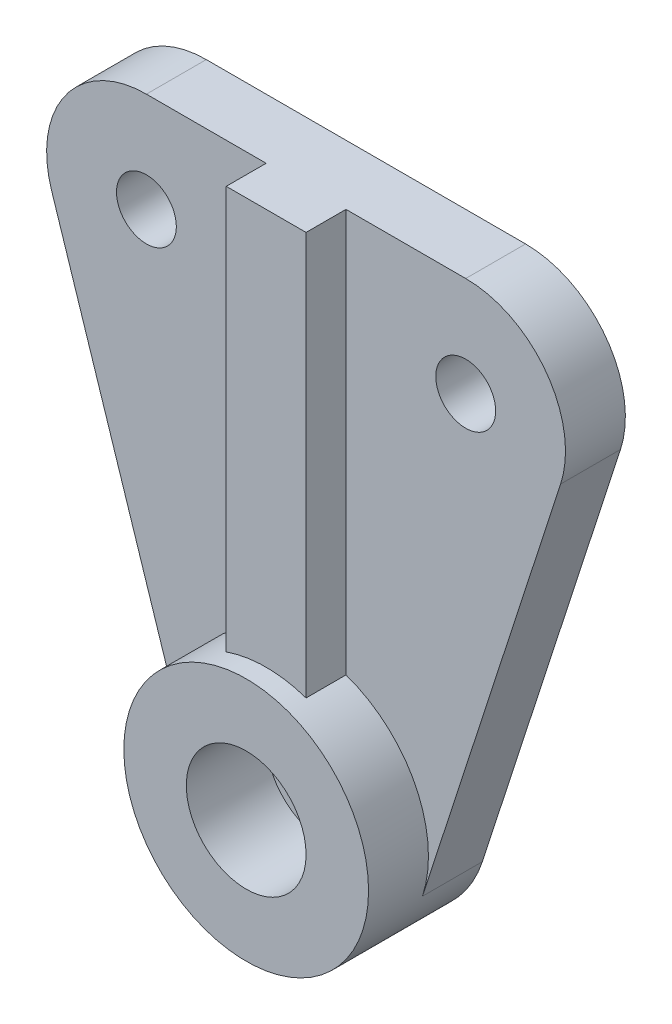
ISO-10303-21;
HEADER;
FILE_DESCRIPTION(('STEP AP214'),'2;1');
FILE_NAME('part.step','',(''),(''),'','','');
FILE_SCHEMA(('AUTOMOTIVE_DESIGN { 1 0 10303 214 1 1 1 1 }'));
ENDSEC;
DATA;
#1=APPLICATION_CONTEXT('core data for automotive mechanical design processes');
#2=APPLICATION_PROTOCOL_DEFINITION('international standard','automotive_design',2000,#1);
#3=PRODUCT_CONTEXT('',#1,'mechanical');
#4=PRODUCT('Part','Part','',(#3));
#5=PRODUCT_RELATED_PRODUCT_CATEGORY('part','',(#4));
#6=PRODUCT_DEFINITION_FORMATION('','',#4);
#7=PRODUCT_DEFINITION_CONTEXT('part definition',#1,'design');
#8=PRODUCT_DEFINITION('design','',#6,#7);
#9=PRODUCT_DEFINITION_SHAPE('','',#8);
#10=(LENGTH_UNIT() NAMED_UNIT(*) SI_UNIT(.MILLI.,.METRE.));
#11=(NAMED_UNIT(*) PLANE_ANGLE_UNIT() SI_UNIT($,.RADIAN.));
#12=(NAMED_UNIT(*) SI_UNIT($,.STERADIAN.) SOLID_ANGLE_UNIT());
#13=UNCERTAINTY_MEASURE_WITH_UNIT(LENGTH_MEASURE(1.E-05),#10,'distance_accuracy_value','');
#14=(GEOMETRIC_REPRESENTATION_CONTEXT(3) GLOBAL_UNCERTAINTY_ASSIGNED_CONTEXT((#13)) GLOBAL_UNIT_ASSIGNED_CONTEXT((#10,
#11,#12)) REPRESENTATION_CONTEXT('',''));
#15=CARTESIAN_POINT('',(0.,0.,0.));
#16=DIRECTION('',(0.,0.,1.));
#17=DIRECTION('',(1.,0.,0.));
#18=AXIS2_PLACEMENT_3D('',#15,#16,#17);
#19=CARTESIAN_POINT('',(-8.,21.,3.));
#20=DIRECTION('',(0.,0.,1.));
#21=DIRECTION('',(1.,0.,0.));
#22=AXIS2_PLACEMENT_3D('',#19,#20,#21);
#23=PLANE('',#22);
#24=CARTESIAN_POINT('',(8.,21.,3.));
#25=DIRECTION('',(0.,0.,1.));
#26=DIRECTION('',(1.,0.,0.));
#27=AXIS2_PLACEMENT_3D('',#24,#25,#26);
#28=CIRCLE('',#27,1.5);
#29=CARTESIAN_POINT('',(9.5,21.,3.));
#30=VERTEX_POINT('',#29);
#31=EDGE_CURVE('E151',#30,#30,#28,.T.);
#32=ORIENTED_EDGE('',*,*,#31,.F.);
#33=EDGE_LOOP('',(#32));
#34=FACE_BOUND('',#33,.T.);
#35=DIRECTION('',(-1.,0.,0.));
#36=VECTOR('',#35,1.);
#37=CARTESIAN_POINT('',(-8.,26.,3.));
#38=LINE('',#37,#36);
#39=CARTESIAN_POINT('',(8.,26.,3.));
#40=VERTEX_POINT('',#39);
#41=CARTESIAN_POINT('',(2.,26.,3.));
#42=VERTEX_POINT('',#41);
#43=EDGE_CURVE('E169',#40,#42,#38,.T.);
#44=ORIENTED_EDGE('',*,*,#43,.T.);
#45=DIRECTION('',(0.,1.,0.));
#46=VECTOR('',#45,1.);
#47=CARTESIAN_POINT('',(2.,5.34684015405273,3.));
#48=LINE('',#47,#46);
#49=CARTESIAN_POINT('',(2.,5.79627489310511,3.));
#50=VERTEX_POINT('',#49);
#51=EDGE_CURVE('E127',#50,#42,#48,.T.);
#52=ORIENTED_EDGE('',*,*,#51,.F.);
#53=CARTESIAN_POINT('',(0.,0.,3.));
#54=DIRECTION('',(0.,0.,1.));
#55=DIRECTION('',(1.,0.,0.));
#56=AXIS2_PLACEMENT_3D('',#53,#54,#55);
#57=CIRCLE('',#56,6.13162316490834);
#58=CARTESIAN_POINT('',(5.83257689393837,-1.89152039712419,3.));
#59=VERTEX_POINT('',#58);
#60=EDGE_CURVE('E142',#59,#50,#57,.T.);
#61=ORIENTED_EDGE('',*,*,#60,.F.);
#62=DIRECTION('',(0.308486080480203,0.951228856874076,0.));
#63=VECTOR('',#62,1.);
#64=CARTESIAN_POINT('',(5.83257689393837,-1.89152039712419,3.));
#65=LINE('',#64,#63);
#66=CARTESIAN_POINT('',(12.7561442843704,19.457569597599,3.));
#67=VERTEX_POINT('',#66);
#68=EDGE_CURVE('E164',#59,#67,#65,.T.);
#69=ORIENTED_EDGE('',*,*,#68,.T.);
#70=CARTESIAN_POINT('',(8.,21.,3.));
#71=DIRECTION('',(0.,0.,1.));
#72=DIRECTION('',(1.,0.,0.));
#73=AXIS2_PLACEMENT_3D('',#70,#71,#72);
#74=CIRCLE('',#73,5.);
#75=EDGE_CURVE('E166',#67,#40,#74,.T.);
#76=ORIENTED_EDGE('',*,*,#75,.T.);
#77=EDGE_LOOP('',(#44,#52,#61,#69,#76));
#78=FACE_BOUND('',#77,.T.);
#79=ADVANCED_FACE('F32',(#34,#78),#23,.T.);
#80=CARTESIAN_POINT('',(-8.,21.,3.));
#81=DIRECTION('',(0.,0.,1.));
#82=DIRECTION('',(1.,0.,0.));
#83=AXIS2_PLACEMENT_3D('',#80,#81,#82);
#84=CIRCLE('',#83,1.5);
#85=CARTESIAN_POINT('',(-6.5,21.,3.));
#86=VERTEX_POINT('',#85);
#87=EDGE_CURVE('E145',#86,#86,#84,.T.);
#88=ORIENTED_EDGE('',*,*,#87,.F.);
#89=EDGE_LOOP('',(#88));
#90=FACE_BOUND('',#89,.T.);
#91=CARTESIAN_POINT('',(-2.,5.79627489310511,3.));
#92=VERTEX_POINT('',#91);
#93=CARTESIAN_POINT('',(-5.83257689393837,-1.89152039712419,3.));
#94=VERTEX_POINT('',#93);
#95=EDGE_CURVE('E144',#92,#94,#57,.T.);
#96=ORIENTED_EDGE('',*,*,#95,.F.);
#97=DIRECTION('',(0.,-1.,0.));
#98=VECTOR('',#97,1.);
#99=CARTESIAN_POINT('',(-2.,5.34684015405273,3.));
#100=LINE('',#99,#98);
#101=CARTESIAN_POINT('',(-2.,26.,3.));
#102=VERTEX_POINT('',#101);
#103=EDGE_CURVE('E113',#102,#92,#100,.T.);
#104=ORIENTED_EDGE('',*,*,#103,.F.);
#105=CARTESIAN_POINT('',(-8.,26.,3.));
#106=VERTEX_POINT('',#105);
#107=EDGE_CURVE('E168',#102,#106,#38,.T.);
#108=ORIENTED_EDGE('',*,*,#107,.T.);
#109=CARTESIAN_POINT('',(-8.,21.,3.));
#110=DIRECTION('',(0.,0.,1.));
#111=DIRECTION('',(1.,0.,0.));
#112=AXIS2_PLACEMENT_3D('',#109,#110,#111);
#113=CIRCLE('',#112,5.);
#114=CARTESIAN_POINT('',(-12.7561442843704,19.457569597599,3.));
#115=VERTEX_POINT('',#114);
#116=EDGE_CURVE('E157',#106,#115,#113,.T.);
#117=ORIENTED_EDGE('',*,*,#116,.T.);
#118=DIRECTION('',(0.308486080480203,-0.951228856874076,0.));
#119=VECTOR('',#118,1.);
#120=CARTESIAN_POINT('',(-12.7561442843704,19.457569597599,3.));
#121=LINE('',#120,#119);
#122=EDGE_CURVE('E160',#115,#94,#121,.T.);
#123=ORIENTED_EDGE('',*,*,#122,.T.);
#124=EDGE_LOOP('',(#96,#104,#108,#117,#123));
#125=FACE_BOUND('',#124,.T.);
#126=ADVANCED_FACE('F231',(#90,#125),#23,.T.);
#127=CARTESIAN_POINT('',(0.,0.,3.));
#128=DIRECTION('',(0.,0.,-1.));
#129=DIRECTION('',(-1.,0.,0.));
#130=AXIS2_PLACEMENT_3D('',#127,#128,#129);
#131=CYLINDRICAL_SURFACE('',#130,6.13162316490834);
#132=CARTESIAN_POINT('',(0.,0.,6.));
#133=DIRECTION('',(0.,0.,1.));
#134=DIRECTION('',(1.,0.,0.));
#135=AXIS2_PLACEMENT_3D('',#132,#133,#134);
#136=CIRCLE('',#135,6.13162316490834);
#137=CARTESIAN_POINT('',(6.13162316490834,0.,6.));
#138=VERTEX_POINT('',#137);
#139=EDGE_CURVE('E137',#138,#138,#136,.T.);
#140=ORIENTED_EDGE('',*,*,#139,.F.);
#141=EDGE_LOOP('',(#140));
#142=FACE_BOUND('',#141,.T.);
#143=DIRECTION('',(0.,0.,-1.));
#144=VECTOR('',#143,1.);
#145=CARTESIAN_POINT('',(2.,5.7962748931051,3.));
#146=LINE('',#145,#144);
#147=CARTESIAN_POINT('',(2.,5.7962748931051,5.));
#148=VERTEX_POINT('',#147);
#149=EDGE_CURVE('E11',#148,#50,#146,.T.);
#150=ORIENTED_EDGE('',*,*,#149,.F.);
#151=CARTESIAN_POINT('',(0.,0.,5.));
#152=DIRECTION('',(0.,0.,-1.));
#153=DIRECTION('',(-1.,0.,0.));
#154=AXIS2_PLACEMENT_3D('',#151,#152,#153);
#155=CIRCLE('',#154,6.13162316490834);
#156=CARTESIAN_POINT('',(-2.,5.79627489310511,5.));
#157=VERTEX_POINT('',#156);
#158=EDGE_CURVE('E49',#157,#148,#155,.T.);
#159=ORIENTED_EDGE('',*,*,#158,.F.);
#160=DIRECTION('',(0.,0.,-1.));
#161=VECTOR('',#160,1.);
#162=CARTESIAN_POINT('',(-2.,5.79627489310511,3.));
#163=LINE('',#162,#161);
#164=EDGE_CURVE('E40',#92,#157,#163,.F.);
#165=ORIENTED_EDGE('',*,*,#164,.F.);
#166=ORIENTED_EDGE('',*,*,#95,.T.);
#167=DIRECTION('',(0.,0.,-1.));
#168=VECTOR('',#167,1.);
#169=CARTESIAN_POINT('',(-5.83257689393837,-1.89152039712419,3.));
#170=LINE('',#169,#168);
#171=CARTESIAN_POINT('',(-5.83257689393837,-1.89152039712419,0.));
#172=VERTEX_POINT('',#171);
#173=EDGE_CURVE('E194',#94,#172,#170,.T.);
#174=ORIENTED_EDGE('',*,*,#173,.T.);
#175=CARTESIAN_POINT('',(0.,0.,0.));
#176=DIRECTION('',(0.,0.,1.));
#177=DIRECTION('',(1.,0.,0.));
#178=AXIS2_PLACEMENT_3D('',#175,#176,#177);
#179=CIRCLE('',#178,6.13162316490834);
#180=CARTESIAN_POINT('',(5.83257689393837,-1.89152039712419,0.));
#181=VERTEX_POINT('',#180);
#182=EDGE_CURVE('E176',#172,#181,#179,.T.);
#183=ORIENTED_EDGE('',*,*,#182,.T.);
#184=DIRECTION('',(0.,0.,-1.));
#185=VECTOR('',#184,1.);
#186=CARTESIAN_POINT('',(5.83257689393837,-1.89152039712419,3.));
#187=LINE('',#186,#185);
#188=EDGE_CURVE('E191',#59,#181,#187,.T.);
#189=ORIENTED_EDGE('',*,*,#188,.F.);
#190=ORIENTED_EDGE('',*,*,#60,.T.);
#191=EDGE_LOOP('',(#150,#159,#165,#166,#174,#183,#189,#190));
#192=FACE_BOUND('',#191,.T.);
#193=ADVANCED_FACE('F228',(#142,#192),#131,.T.);
#194=CARTESIAN_POINT('',(-8.,21.,0.));
#195=DIRECTION('',(0.,0.,1.));
#196=DIRECTION('',(1.,0.,0.));
#197=AXIS2_PLACEMENT_3D('',#194,#195,#196);
#198=PLANE('',#197);
#199=CARTESIAN_POINT('',(-8.,21.,0.));
#200=DIRECTION('',(0.,0.,1.));
#201=DIRECTION('',(1.,0.,0.));
#202=AXIS2_PLACEMENT_3D('',#199,#200,#201);
#203=CIRCLE('',#202,5.);
#204=CARTESIAN_POINT('',(-8.,26.,0.));
#205=VERTEX_POINT('',#204);
#206=CARTESIAN_POINT('',(-12.7561442843704,19.457569597599,0.));
#207=VERTEX_POINT('',#206);
#208=EDGE_CURVE('E154',#205,#207,#203,.T.);
#209=ORIENTED_EDGE('',*,*,#208,.F.);
#210=DIRECTION('',(-1.,0.,0.));
#211=VECTOR('',#210,1.);
#212=CARTESIAN_POINT('',(-8.,26.,0.));
#213=LINE('',#212,#211);
#214=CARTESIAN_POINT('',(8.,26.,0.));
#215=VERTEX_POINT('',#214);
#216=EDGE_CURVE('E161',#215,#205,#213,.T.);
#217=ORIENTED_EDGE('',*,*,#216,.F.);
#218=CARTESIAN_POINT('',(8.,21.,0.));
#219=DIRECTION('',(0.,0.,1.));
#220=DIRECTION('',(1.,0.,0.));
#221=AXIS2_PLACEMENT_3D('',#218,#219,#220);
#222=CIRCLE('',#221,5.);
#223=CARTESIAN_POINT('',(12.7561442843704,19.457569597599,0.));
#224=VERTEX_POINT('',#223);
#225=EDGE_CURVE('E180',#224,#215,#222,.T.);
#226=ORIENTED_EDGE('',*,*,#225,.F.);
#227=DIRECTION('',(0.308486080480203,0.951228856874076,0.));
#228=VECTOR('',#227,1.);
#229=CARTESIAN_POINT('',(5.83257689393837,-1.89152039712419,0.));
#230=LINE('',#229,#228);
#231=EDGE_CURVE('E178',#181,#224,#230,.T.);
#232=ORIENTED_EDGE('',*,*,#231,.F.);
#233=ORIENTED_EDGE('',*,*,#182,.F.);
#234=DIRECTION('',(0.308486080480203,-0.951228856874076,0.));
#235=VECTOR('',#234,1.);
#236=CARTESIAN_POINT('',(-12.7561442843704,19.457569597599,0.));
#237=LINE('',#236,#235);
#238=EDGE_CURVE('E174',#207,#172,#237,.T.);
#239=ORIENTED_EDGE('',*,*,#238,.F.);
#240=EDGE_LOOP('',(#209,#217,#226,#232,#233,#239));
#241=FACE_BOUND('',#240,.T.);
#242=CARTESIAN_POINT('',(8.,21.,0.));
#243=DIRECTION('',(0.,0.,1.));
#244=DIRECTION('',(1.,0.,0.));
#245=AXIS2_PLACEMENT_3D('',#242,#243,#244);
#246=CIRCLE('',#245,1.5);
#247=CARTESIAN_POINT('',(9.5,21.,0.));
#248=VERTEX_POINT('',#247);
#249=EDGE_CURVE('E148',#248,#248,#246,.T.);
#250=ORIENTED_EDGE('',*,*,#249,.T.);
#251=EDGE_LOOP('',(#250));
#252=FACE_BOUND('',#251,.T.);
#253=CARTESIAN_POINT('',(-8.,21.,0.));
#254=DIRECTION('',(0.,0.,1.));
#255=DIRECTION('',(1.,0.,0.));
#256=AXIS2_PLACEMENT_3D('',#253,#254,#255);
#257=CIRCLE('',#256,1.5);
#258=CARTESIAN_POINT('',(-6.5,21.,0.));
#259=VERTEX_POINT('',#258);
#260=EDGE_CURVE('E141',#259,#259,#257,.T.);
#261=ORIENTED_EDGE('',*,*,#260,.T.);
#262=EDGE_LOOP('',(#261));
#263=FACE_BOUND('',#262,.T.);
#264=CARTESIAN_POINT('',(0.,0.,0.));
#265=DIRECTION('',(0.,0.,-1.));
#266=DIRECTION('',(-1.,0.,0.));
#267=AXIS2_PLACEMENT_3D('',#264,#265,#266);
#268=CIRCLE('',#267,1.6);
#269=CARTESIAN_POINT('',(-1.6,0.,0.));
#270=VERTEX_POINT('',#269);
#271=EDGE_CURVE('E128',#270,#270,#268,.T.);
#272=ORIENTED_EDGE('',*,*,#271,.F.);
#273=EDGE_LOOP('',(#272));
#274=FACE_BOUND('',#273,.T.);
#275=ADVANCED_FACE('F230',(#241,#252,#263,#274),#198,.F.);
#276=CARTESIAN_POINT('',(-8.,21.,3.));
#277=DIRECTION('',(0.,0.,-1.));
#278=DIRECTION('',(-1.,0.,0.));
#279=AXIS2_PLACEMENT_3D('',#276,#277,#278);
#280=CYLINDRICAL_SURFACE('',#279,5.);
#281=ORIENTED_EDGE('',*,*,#208,.T.);
#282=DIRECTION('',(0.,0.,-1.));
#283=VECTOR('',#282,1.);
#284=CARTESIAN_POINT('',(-12.7561442843704,19.457569597599,3.));
#285=LINE('',#284,#283);
#286=EDGE_CURVE('E197',#115,#207,#285,.T.);
#287=ORIENTED_EDGE('',*,*,#286,.F.);
#288=ORIENTED_EDGE('',*,*,#116,.F.);
#289=DIRECTION('',(0.,0.,-1.));
#290=VECTOR('',#289,1.);
#291=CARTESIAN_POINT('',(-8.,26.,3.));
#292=LINE('',#291,#290);
#293=EDGE_CURVE('E171',#106,#205,#292,.T.);
#294=ORIENTED_EDGE('',*,*,#293,.T.);
#295=EDGE_LOOP('',(#281,#287,#288,#294));
#296=FACE_BOUND('',#295,.T.);
#297=ADVANCED_FACE('F34',(#296),#280,.T.);
#298=CARTESIAN_POINT('',(-12.7561442843704,19.457569597599,3.));
#299=DIRECTION('',(0.951228856874076,0.308486080480203,0.));
#300=DIRECTION('',(-0.308486080480203,0.951228856874076,0.));
#301=AXIS2_PLACEMENT_3D('',#298,#299,#300);
#302=PLANE('',#301);
#303=ORIENTED_EDGE('',*,*,#238,.T.);
#304=ORIENTED_EDGE('',*,*,#173,.F.);
#305=ORIENTED_EDGE('',*,*,#122,.F.);
#306=ORIENTED_EDGE('',*,*,#286,.T.);
#307=EDGE_LOOP('',(#303,#304,#305,#306));
#308=FACE_BOUND('',#307,.T.);
#309=ADVANCED_FACE('F259',(#308),#302,.F.);
#310=CARTESIAN_POINT('',(5.83257689393837,-1.89152039712419,3.));
#311=DIRECTION('',(-0.951228856874076,0.308486080480203,0.));
#312=DIRECTION('',(-0.308486080480203,-0.951228856874076,0.));
#313=AXIS2_PLACEMENT_3D('',#310,#311,#312);
#314=PLANE('',#313);
#315=ORIENTED_EDGE('',*,*,#231,.T.);
#316=DIRECTION('',(0.,0.,-1.));
#317=VECTOR('',#316,1.);
#318=CARTESIAN_POINT('',(12.7561442843704,19.457569597599,3.));
#319=LINE('',#318,#317);
#320=EDGE_CURVE('E188',#67,#224,#319,.T.);
#321=ORIENTED_EDGE('',*,*,#320,.F.);
#322=ORIENTED_EDGE('',*,*,#68,.F.);
#323=ORIENTED_EDGE('',*,*,#188,.T.);
#324=EDGE_LOOP('',(#315,#321,#322,#323));
#325=FACE_BOUND('',#324,.T.);
#326=ADVANCED_FACE('F256',(#325),#314,.F.);
#327=CARTESIAN_POINT('',(8.,21.,3.));
#328=DIRECTION('',(0.,0.,-1.));
#329=DIRECTION('',(-1.,0.,0.));
#330=AXIS2_PLACEMENT_3D('',#327,#328,#329);
#331=CYLINDRICAL_SURFACE('',#330,5.);
#332=ORIENTED_EDGE('',*,*,#225,.T.);
#333=DIRECTION('',(0.,0.,-1.));
#334=VECTOR('',#333,1.);
#335=CARTESIAN_POINT('',(8.,26.,3.));
#336=LINE('',#335,#334);
#337=EDGE_CURVE('E185',#40,#215,#336,.T.);
#338=ORIENTED_EDGE('',*,*,#337,.F.);
#339=ORIENTED_EDGE('',*,*,#75,.F.);
#340=ORIENTED_EDGE('',*,*,#320,.T.);
#341=EDGE_LOOP('',(#332,#338,#339,#340));
#342=FACE_BOUND('',#341,.T.);
#343=ADVANCED_FACE('F254',(#342),#331,.T.);
#344=CARTESIAN_POINT('',(-8.,26.,3.));
#345=DIRECTION('',(0.,-1.,0.));
#346=DIRECTION('',(0.,0.,-1.));
#347=AXIS2_PLACEMENT_3D('',#344,#345,#346);
#348=PLANE('',#347);
#349=ORIENTED_EDGE('',*,*,#216,.T.);
#350=ORIENTED_EDGE('',*,*,#293,.F.);
#351=ORIENTED_EDGE('',*,*,#107,.F.);
#352=DIRECTION('',(0.,0.,-1.));
#353=VECTOR('',#352,1.);
#354=CARTESIAN_POINT('',(-2.,26.,5.));
#355=LINE('',#354,#353);
#356=CARTESIAN_POINT('',(-2.,26.,5.));
#357=VERTEX_POINT('',#356);
#358=EDGE_CURVE('E121',#357,#102,#355,.T.);
#359=ORIENTED_EDGE('',*,*,#358,.F.);
#360=DIRECTION('',(-1.,0.,0.));
#361=VECTOR('',#360,1.);
#362=CARTESIAN_POINT('',(-2.,26.,5.));
#363=LINE('',#362,#361);
#364=CARTESIAN_POINT('',(2.,26.,5.));
#365=VERTEX_POINT('',#364);
#366=EDGE_CURVE('E109',#365,#357,#363,.T.);
#367=ORIENTED_EDGE('',*,*,#366,.F.);
#368=DIRECTION('',(0.,0.,-1.));
#369=VECTOR('',#368,1.);
#370=CARTESIAN_POINT('',(2.,26.,5.));
#371=LINE('',#370,#369);
#372=EDGE_CURVE('E119',#365,#42,#371,.T.);
#373=ORIENTED_EDGE('',*,*,#372,.T.);
#374=ORIENTED_EDGE('',*,*,#43,.F.);
#375=ORIENTED_EDGE('',*,*,#337,.T.);
#376=EDGE_LOOP('',(#349,#350,#351,#359,#367,#373,#374,#375));
#377=FACE_BOUND('',#376,.T.);
#378=ADVANCED_FACE('F117',(#377),#348,.F.);
#379=CARTESIAN_POINT('',(8.,21.,3.));
#380=DIRECTION('',(0.,0.,-1.));
#381=DIRECTION('',(-1.,0.,0.));
#382=AXIS2_PLACEMENT_3D('',#379,#380,#381);
#383=CYLINDRICAL_SURFACE('',#382,1.5);
#384=ORIENTED_EDGE('',*,*,#31,.T.);
#385=EDGE_LOOP('',(#384));
#386=FACE_BOUND('',#385,.T.);
#387=ORIENTED_EDGE('',*,*,#249,.F.);
#388=EDGE_LOOP('',(#387));
#389=FACE_BOUND('',#388,.T.);
#390=ADVANCED_FACE('F249',(#386,#389),#383,.F.);
#391=CARTESIAN_POINT('',(-8.,21.,3.));
#392=DIRECTION('',(0.,0.,-1.));
#393=DIRECTION('',(-1.,0.,0.));
#394=AXIS2_PLACEMENT_3D('',#391,#392,#393);
#395=CYLINDRICAL_SURFACE('',#394,1.5);
#396=ORIENTED_EDGE('',*,*,#87,.T.);
#397=EDGE_LOOP('',(#396));
#398=FACE_BOUND('',#397,.T.);
#399=ORIENTED_EDGE('',*,*,#260,.F.);
#400=EDGE_LOOP('',(#399));
#401=FACE_BOUND('',#400,.T.);
#402=ADVANCED_FACE('F224',(#398,#401),#395,.F.);
#403=CARTESIAN_POINT('',(0.,0.,6.));
#404=DIRECTION('',(0.,0.,1.));
#405=DIRECTION('',(1.,0.,0.));
#406=AXIS2_PLACEMENT_3D('',#403,#404,#405);
#407=PLANE('',#406);
#408=CARTESIAN_POINT('',(0.,0.,6.));
#409=DIRECTION('',(0.,0.,1.));
#410=DIRECTION('',(1.,0.,0.));
#411=AXIS2_PLACEMENT_3D('',#408,#409,#410);
#412=CIRCLE('',#411,3.);
#413=CARTESIAN_POINT('',(3.,0.,6.));
#414=VERTEX_POINT('',#413);
#415=EDGE_CURVE('E209',#414,#414,#412,.T.);
#416=ORIENTED_EDGE('',*,*,#415,.F.);
#417=EDGE_LOOP('',(#416));
#418=FACE_BOUND('',#417,.T.);
#419=ORIENTED_EDGE('',*,*,#139,.T.);
#420=EDGE_LOOP('',(#419));
#421=FACE_BOUND('',#420,.T.);
#422=ADVANCED_FACE('F220',(#418,#421),#407,.T.);
#423=CARTESIAN_POINT('',(0.,0.,2.));
#424=DIRECTION('',(0.,0.,-1.));
#425=DIRECTION('',(-1.,0.,0.));
#426=AXIS2_PLACEMENT_3D('',#423,#424,#425);
#427=PLANE('',#426);
#428=CARTESIAN_POINT('',(0.,0.,2.));
#429=DIRECTION('',(0.,0.,-1.));
#430=DIRECTION('',(-1.,0.,0.));
#431=AXIS2_PLACEMENT_3D('',#428,#429,#430);
#432=CIRCLE('',#431,1.6);
#433=CARTESIAN_POINT('',(-1.6,0.,2.));
#434=VERTEX_POINT('',#433);
#435=EDGE_CURVE('E131',#434,#434,#432,.T.);
#436=ORIENTED_EDGE('',*,*,#435,.T.);
#437=EDGE_LOOP('',(#436));
#438=FACE_BOUND('',#437,.T.);
#439=CARTESIAN_POINT('',(0.,0.,2.));
#440=DIRECTION('',(0.,0.,-1.));
#441=DIRECTION('',(-1.,0.,0.));
#442=AXIS2_PLACEMENT_3D('',#439,#440,#441);
#443=CIRCLE('',#442,3.);
#444=CARTESIAN_POINT('',(-3.,0.,2.));
#445=VERTEX_POINT('',#444);
#446=EDGE_CURVE('E207',#445,#445,#443,.F.);
#447=ORIENTED_EDGE('',*,*,#446,.T.);
#448=EDGE_LOOP('',(#447));
#449=FACE_BOUND('',#448,.T.);
#450=ADVANCED_FACE('F223',(#438,#449),#427,.F.);
#451=CARTESIAN_POINT('',(0.,0.,2.));
#452=DIRECTION('',(0.,0.,-1.));
#453=DIRECTION('',(-1.,0.,0.));
#454=AXIS2_PLACEMENT_3D('',#451,#452,#453);
#455=CYLINDRICAL_SURFACE('',#454,1.6);
#456=ORIENTED_EDGE('',*,*,#435,.F.);
#457=EDGE_LOOP('',(#456));
#458=FACE_BOUND('',#457,.T.);
#459=ORIENTED_EDGE('',*,*,#271,.T.);
#460=EDGE_LOOP('',(#459));
#461=FACE_BOUND('',#460,.T.);
#462=ADVANCED_FACE('F331',(#458,#461),#455,.F.);
#463=CARTESIAN_POINT('',(2.,5.34684015405273,5.));
#464=DIRECTION('',(-1.,0.,0.));
#465=DIRECTION('',(0.,0.,1.));
#466=AXIS2_PLACEMENT_3D('',#463,#464,#465);
#467=PLANE('',#466);
#468=DIRECTION('',(0.,1.,0.));
#469=VECTOR('',#468,1.);
#470=CARTESIAN_POINT('',(2.,5.34684015405273,5.));
#471=LINE('',#470,#469);
#472=EDGE_CURVE('E105',#148,#365,#471,.T.);
#473=ORIENTED_EDGE('',*,*,#472,.F.);
#474=ORIENTED_EDGE('',*,*,#149,.T.);
#475=ORIENTED_EDGE('',*,*,#51,.T.);
#476=ORIENTED_EDGE('',*,*,#372,.F.);
#477=EDGE_LOOP('',(#473,#474,#475,#476));
#478=FACE_BOUND('',#477,.T.);
#479=ADVANCED_FACE('F126',(#478),#467,.F.);
#480=CARTESIAN_POINT('',(-2.,5.34684015405273,5.));
#481=DIRECTION('',(1.,0.,0.));
#482=DIRECTION('',(0.,0.,-1.));
#483=AXIS2_PLACEMENT_3D('',#480,#481,#482);
#484=PLANE('',#483);
#485=ORIENTED_EDGE('',*,*,#103,.T.);
#486=ORIENTED_EDGE('',*,*,#164,.T.);
#487=DIRECTION('',(0.,-1.,0.));
#488=VECTOR('',#487,1.);
#489=CARTESIAN_POINT('',(-2.,5.34684015405273,5.));
#490=LINE('',#489,#488);
#491=EDGE_CURVE('E123',#357,#157,#490,.T.);
#492=ORIENTED_EDGE('',*,*,#491,.F.);
#493=ORIENTED_EDGE('',*,*,#358,.T.);
#494=EDGE_LOOP('',(#485,#486,#492,#493));
#495=FACE_BOUND('',#494,.T.);
#496=ADVANCED_FACE('F202',(#495),#484,.F.);
#497=CARTESIAN_POINT('',(0.,0.,5.));
#498=DIRECTION('',(0.,0.,-1.));
#499=DIRECTION('',(-1.,0.,0.));
#500=AXIS2_PLACEMENT_3D('',#497,#498,#499);
#501=PLANE('',#500);
#502=ORIENTED_EDGE('',*,*,#491,.T.);
#503=ORIENTED_EDGE('',*,*,#158,.T.);
#504=ORIENTED_EDGE('',*,*,#472,.T.);
#505=ORIENTED_EDGE('',*,*,#366,.T.);
#506=EDGE_LOOP('',(#502,#503,#504,#505));
#507=FACE_BOUND('',#506,.T.);
#508=ADVANCED_FACE('F108',(#507),#501,.F.);
#509=CARTESIAN_POINT('',(0.,0.,-6.48528137423857));
#510=DIRECTION('',(0.,0.,1.));
#511=DIRECTION('',(1.,0.,0.));
#512=AXIS2_PLACEMENT_3D('',#509,#510,#511);
#513=CYLINDRICAL_SURFACE('',#512,3.);
#514=ORIENTED_EDGE('',*,*,#415,.T.);
#515=EDGE_LOOP('',(#514));
#516=FACE_BOUND('',#515,.T.);
#517=ORIENTED_EDGE('',*,*,#446,.F.);
#518=EDGE_LOOP('',(#517));
#519=FACE_BOUND('',#518,.T.);
#520=ADVANCED_FACE('F217',(#516,#519),#513,.F.);
#521=CLOSED_SHELL('',(#79,#126,#193,#275,#297,#309,#326,#343,#378,#390,#402,#422,#450,#462,#479,
#496,#508,#520));
#522=MANIFOLD_SOLID_BREP('B2',#521);
#523=ADVANCED_BREP_SHAPE_REPRESENTATION('',(#18,#522),#14);
#524=SHAPE_DEFINITION_REPRESENTATION(#9,#523);
ENDSEC;
END-ISO-10303-21;
